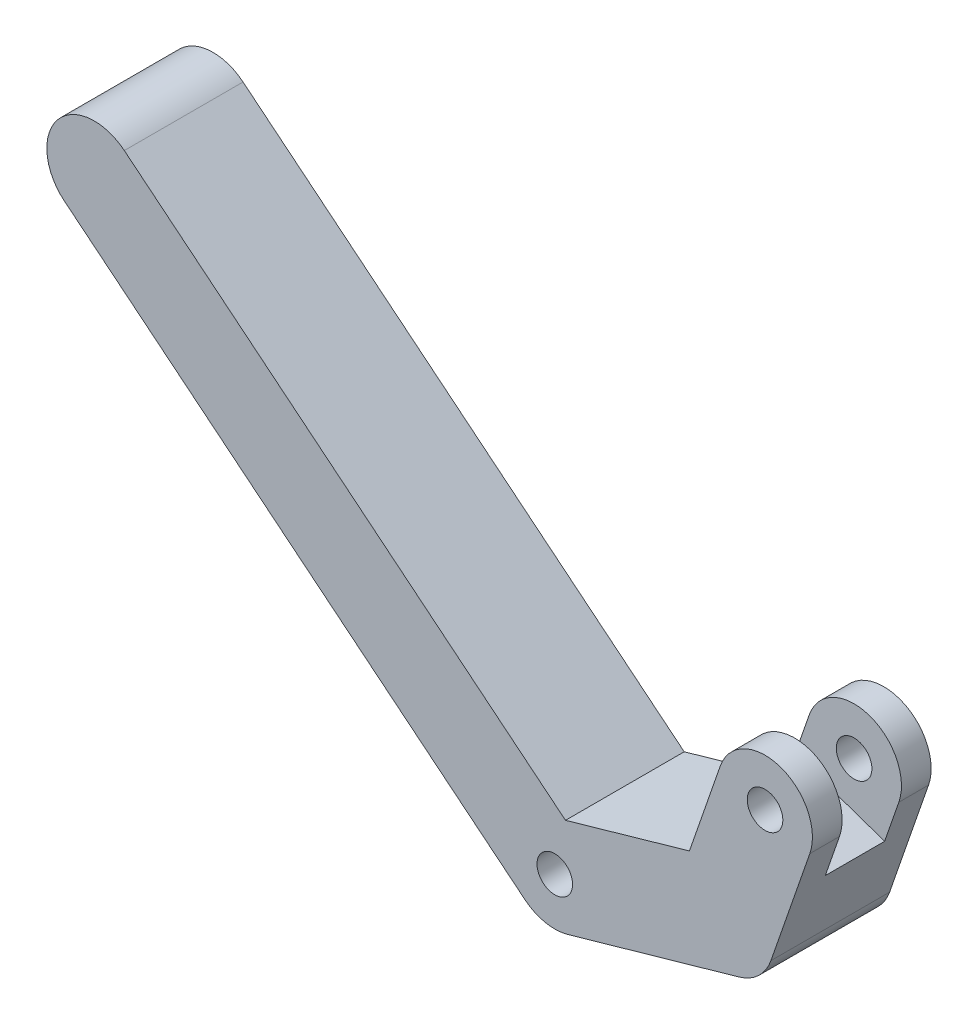
ISO-10303-21;
HEADER;
FILE_DESCRIPTION(('STEP AP214'),'2;1');
FILE_NAME('part.step','',(''),(''),'','','');
FILE_SCHEMA(('AUTOMOTIVE_DESIGN { 1 0 10303 214 1 1 1 1 }'));
ENDSEC;
DATA;
#1=APPLICATION_CONTEXT('core data for automotive mechanical design processes');
#2=APPLICATION_PROTOCOL_DEFINITION('international standard','automotive_design',2000,#1);
#3=PRODUCT_CONTEXT('',#1,'mechanical');
#4=PRODUCT('Part','Part','',(#3));
#5=PRODUCT_RELATED_PRODUCT_CATEGORY('part','',(#4));
#6=PRODUCT_DEFINITION_FORMATION('','',#4);
#7=PRODUCT_DEFINITION_CONTEXT('part definition',#1,'design');
#8=PRODUCT_DEFINITION('design','',#6,#7);
#9=PRODUCT_DEFINITION_SHAPE('','',#8);
#10=(LENGTH_UNIT() NAMED_UNIT(*) SI_UNIT(.MILLI.,.METRE.));
#11=(NAMED_UNIT(*) PLANE_ANGLE_UNIT() SI_UNIT($,.RADIAN.));
#12=(NAMED_UNIT(*) SI_UNIT($,.STERADIAN.) SOLID_ANGLE_UNIT());
#13=UNCERTAINTY_MEASURE_WITH_UNIT(LENGTH_MEASURE(1.E-05),#10,'distance_accuracy_value','');
#14=(GEOMETRIC_REPRESENTATION_CONTEXT(3) GLOBAL_UNCERTAINTY_ASSIGNED_CONTEXT((#13)) GLOBAL_UNIT_ASSIGNED_CONTEXT((#10,
#11,#12)) REPRESENTATION_CONTEXT('',''));
#15=CARTESIAN_POINT('',(0.,0.,0.));
#16=DIRECTION('',(0.,0.,1.));
#17=DIRECTION('',(1.,0.,0.));
#18=AXIS2_PLACEMENT_3D('',#15,#16,#17);
#19=CARTESIAN_POINT('',(18.1989936370334,2.79280961933587,5.));
#20=DIRECTION('',(-0.944756856127318,0.327771998194518,0.));
#21=DIRECTION('',(-0.327771998194518,-0.944756856127318,0.));
#22=AXIS2_PLACEMENT_3D('',#19,#20,#21);
#23=PLANE('',#22);
#24=DIRECTION('',(0.327771998194519,0.944756856127317,0.));
#25=VECTOR('',#24,1.);
#26=CARTESIAN_POINT('',(20.2803351049442,8.79198475504685,-2.5));
#27=LINE('',#26,#25);
#28=CARTESIAN_POINT('',(20.2803351049442,8.79198475504685,-2.5));
#29=VERTEX_POINT('',#28);
#30=CARTESIAN_POINT('',(21.4767136189786,12.240378180609,-2.5));
#31=VERTEX_POINT('',#30);
#32=EDGE_CURVE('E263',#29,#31,#27,.T.);
#33=ORIENTED_EDGE('',*,*,#32,.F.);
#34=DIRECTION('',(0.,0.,1.));
#35=VECTOR('',#34,1.);
#36=CARTESIAN_POINT('',(20.2803351049442,8.79198475504685,-2.5));
#37=LINE('',#36,#35);
#38=CARTESIAN_POINT('',(20.2803351049442,8.79198475504685,2.5));
#39=VERTEX_POINT('',#38);
#40=EDGE_CURVE('E211',#29,#39,#37,.T.);
#41=ORIENTED_EDGE('',*,*,#40,.T.);
#42=DIRECTION('',(0.327771998194519,0.944756856127317,0.));
#43=VECTOR('',#42,1.);
#44=CARTESIAN_POINT('',(20.2803351049442,8.79198475504685,2.5));
#45=LINE('',#44,#43);
#46=CARTESIAN_POINT('',(21.4767136189786,12.240378180609,2.5));
#47=VERTEX_POINT('',#46);
#48=EDGE_CURVE('E148',#39,#47,#45,.T.);
#49=ORIENTED_EDGE('',*,*,#48,.T.);
#50=DIRECTION('',(0.,0.,-1.));
#51=VECTOR('',#50,1.);
#52=CARTESIAN_POINT('',(21.4767136189786,12.240378180609,5.));
#53=LINE('',#52,#51);
#54=CARTESIAN_POINT('',(21.4767136189786,12.240378180609,5.));
#55=VERTEX_POINT('',#54);
#56=EDGE_CURVE('E144',#55,#47,#53,.T.);
#57=ORIENTED_EDGE('',*,*,#56,.F.);
#58=DIRECTION('',(0.327771998194518,0.944756856127318,0.));
#59=VECTOR('',#58,1.);
#60=CARTESIAN_POINT('',(18.1989936370334,2.79280961933587,5.));
#61=LINE('',#60,#59);
#62=CARTESIAN_POINT('',(18.1989936370334,2.79280961933587,5.));
#63=VERTEX_POINT('',#62);
#64=EDGE_CURVE('E130',#63,#55,#61,.T.);
#65=ORIENTED_EDGE('',*,*,#64,.F.);
#66=DIRECTION('',(0.,0.,-1.));
#67=VECTOR('',#66,1.);
#68=CARTESIAN_POINT('',(18.1989936370334,2.79280961933587,5.));
#69=LINE('',#68,#67);
#70=CARTESIAN_POINT('',(18.1989936370334,2.79280961933587,-5.));
#71=VERTEX_POINT('',#70);
#72=EDGE_CURVE('E151',#63,#71,#69,.T.);
#73=ORIENTED_EDGE('',*,*,#72,.T.);
#74=DIRECTION('',(0.327771998194518,0.944756856127318,0.));
#75=VECTOR('',#74,1.);
#76=CARTESIAN_POINT('',(18.1989936370334,2.79280961933587,-5.));
#77=LINE('',#76,#75);
#78=CARTESIAN_POINT('',(21.4767136189786,12.240378180609,-5.));
#79=VERTEX_POINT('',#78);
#80=EDGE_CURVE('E178',#71,#79,#77,.T.);
#81=ORIENTED_EDGE('',*,*,#80,.T.);
#82=EDGE_CURVE('E152',#31,#79,#53,.T.);
#83=ORIENTED_EDGE('',*,*,#82,.F.);
#84=EDGE_LOOP('',(#33,#41,#49,#57,#65,#73,#81,#83));
#85=FACE_BOUND('',#84,.T.);
#86=ADVANCED_FACE('F36',(#85),#23,.F.);
#87=CARTESIAN_POINT('',(17.7062470526373,13.5484960868831,5.));
#88=DIRECTION('',(0.,0.,-1.));
#89=DIRECTION('',(-1.,0.,0.));
#90=AXIS2_PLACEMENT_3D('',#87,#88,#89);
#91=CYLINDRICAL_SURFACE('',#90,3.99093855936324);
#92=CARTESIAN_POINT('',(17.7062470526373,13.5484960868831,-2.5));
#93=DIRECTION('',(0.,0.,1.));
#94=DIRECTION('',(1.,0.,0.));
#95=AXIS2_PLACEMENT_3D('',#92,#93,#94);
#96=CIRCLE('',#95,3.99093855936324);
#97=CARTESIAN_POINT('',(13.935780486296,14.8566139931571,-2.5));
#98=VERTEX_POINT('',#97);
#99=EDGE_CURVE('E220',#31,#98,#96,.T.);
#100=ORIENTED_EDGE('',*,*,#99,.F.);
#101=ORIENTED_EDGE('',*,*,#82,.T.);
#102=CARTESIAN_POINT('',(17.7062470526373,13.5484960868831,-5.));
#103=DIRECTION('',(0.,0.,1.));
#104=DIRECTION('',(1.,0.,0.));
#105=AXIS2_PLACEMENT_3D('',#102,#103,#104);
#106=CIRCLE('',#105,3.99093855936324);
#107=CARTESIAN_POINT('',(13.935780486296,14.8566139931571,-5.));
#108=VERTEX_POINT('',#107);
#109=EDGE_CURVE('E181',#79,#108,#106,.T.);
#110=ORIENTED_EDGE('',*,*,#109,.T.);
#111=DIRECTION('',(0.,0.,-1.));
#112=VECTOR('',#111,1.);
#113=CARTESIAN_POINT('',(13.935780486296,14.8566139931571,5.));
#114=LINE('',#113,#112);
#115=EDGE_CURVE('E187',#98,#108,#114,.T.);
#116=ORIENTED_EDGE('',*,*,#115,.F.);
#117=EDGE_LOOP('',(#100,#101,#110,#116));
#118=FACE_BOUND('',#117,.T.);
#119=ADVANCED_FACE('F258',(#118),#91,.T.);
#120=CARTESIAN_POINT('',(13.935780486296,14.8566139931571,5.));
#121=DIRECTION('',(0.944756856127317,-0.327771998194519,0.));
#122=DIRECTION('',(0.327771998194519,0.944756856127317,0.));
#123=AXIS2_PLACEMENT_3D('',#120,#121,#122);
#124=PLANE('',#123);
#125=DIRECTION('',(-0.327771998194519,-0.944756856127317,0.));
#126=VECTOR('',#125,1.);
#127=CARTESIAN_POINT('',(13.935780486296,14.8566139931571,-2.5));
#128=LINE('',#127,#126);
#129=CARTESIAN_POINT('',(12.7394019722616,11.4082205675949,-2.5));
#130=VERTEX_POINT('',#129);
#131=EDGE_CURVE('E281',#98,#130,#128,.T.);
#132=ORIENTED_EDGE('',*,*,#131,.F.);
#133=ORIENTED_EDGE('',*,*,#115,.T.);
#134=DIRECTION('',(-0.327771998194519,-0.944756856127317,0.));
#135=VECTOR('',#134,1.);
#136=CARTESIAN_POINT('',(13.935780486296,14.8566139931571,-5.));
#137=LINE('',#136,#135);
#138=CARTESIAN_POINT('',(11.3376461408511,7.36785580295251,-5.));
#139=VERTEX_POINT('',#138);
#140=EDGE_CURVE('E100',#108,#139,#137,.T.);
#141=ORIENTED_EDGE('',*,*,#140,.T.);
#142=DIRECTION('',(0.,0.,-1.));
#143=VECTOR('',#142,1.);
#144=CARTESIAN_POINT('',(11.3376461408511,7.36785580295251,5.));
#145=LINE('',#144,#143);
#146=CARTESIAN_POINT('',(11.3376461408511,7.36785580295251,5.));
#147=VERTEX_POINT('',#146);
#148=EDGE_CURVE('E158',#147,#139,#145,.T.);
#149=ORIENTED_EDGE('',*,*,#148,.F.);
#150=DIRECTION('',(-0.327771998194519,-0.944756856127317,0.));
#151=VECTOR('',#150,1.);
#152=CARTESIAN_POINT('',(13.935780486296,14.8566139931571,5.));
#153=LINE('',#152,#151);
#154=CARTESIAN_POINT('',(13.935780486296,14.8566139931571,5.));
#155=VERTEX_POINT('',#154);
#156=EDGE_CURVE('E62',#155,#147,#153,.T.);
#157=ORIENTED_EDGE('',*,*,#156,.F.);
#158=CARTESIAN_POINT('',(13.935780486296,14.8566139931571,2.5));
#159=VERTEX_POINT('',#158);
#160=EDGE_CURVE('E156',#155,#159,#114,.T.);
#161=ORIENTED_EDGE('',*,*,#160,.T.);
#162=DIRECTION('',(-0.327771998194519,-0.944756856127317,0.));
#163=VECTOR('',#162,1.);
#164=CARTESIAN_POINT('',(13.935780486296,14.8566139931571,2.5));
#165=LINE('',#164,#163);
#166=CARTESIAN_POINT('',(12.7394019722616,11.4082205675949,2.5));
#167=VERTEX_POINT('',#166);
#168=EDGE_CURVE('E274',#159,#167,#165,.T.);
#169=ORIENTED_EDGE('',*,*,#168,.T.);
#170=DIRECTION('',(0.,0.,1.));
#171=VECTOR('',#170,1.);
#172=CARTESIAN_POINT('',(12.7394019722616,11.4082205675949,-2.5));
#173=LINE('',#172,#171);
#174=EDGE_CURVE('E216',#130,#167,#173,.T.);
#175=ORIENTED_EDGE('',*,*,#174,.F.);
#176=EDGE_LOOP('',(#132,#133,#141,#149,#157,#161,#169,#175));
#177=FACE_BOUND('',#176,.T.);
#178=ADVANCED_FACE('F287',(#177),#124,.F.);
#179=CARTESIAN_POINT('',(17.7062470526373,13.5484960868831,-10.));
#180=DIRECTION('',(0.,0.,1.));
#181=DIRECTION('',(1.,0.,0.));
#182=AXIS2_PLACEMENT_3D('',#179,#180,#181);
#183=CYLINDRICAL_SURFACE('',#182,1.5);
#184=CARTESIAN_POINT('',(17.7062470526373,13.5484960868831,-5.));
#185=DIRECTION('',(0.,0.,1.));
#186=DIRECTION('',(1.,0.,0.));
#187=AXIS2_PLACEMENT_3D('',#184,#185,#186);
#188=CIRCLE('',#187,1.5);
#189=CARTESIAN_POINT('',(19.2062470526373,13.5484960868831,-5.));
#190=VERTEX_POINT('',#189);
#191=EDGE_CURVE('E166',#190,#190,#188,.T.);
#192=ORIENTED_EDGE('',*,*,#191,.F.);
#193=EDGE_LOOP('',(#192));
#194=FACE_BOUND('',#193,.T.);
#195=CARTESIAN_POINT('',(17.7062470526373,13.5484960868831,-2.5));
#196=DIRECTION('',(0.,0.,1.));
#197=DIRECTION('',(1.,0.,0.));
#198=AXIS2_PLACEMENT_3D('',#195,#196,#197);
#199=CIRCLE('',#198,1.5);
#200=CARTESIAN_POINT('',(19.2062470526373,13.5484960868831,-2.5));
#201=VERTEX_POINT('',#200);
#202=EDGE_CURVE('E40',#201,#201,#199,.F.);
#203=ORIENTED_EDGE('',*,*,#202,.F.);
#204=EDGE_LOOP('',(#203));
#205=FACE_BOUND('',#204,.T.);
#206=ADVANCED_FACE('F345',(#194,#205),#183,.F.);
#207=CARTESIAN_POINT('',(11.3376461408511,7.36785580295251,5.));
#208=DIRECTION('',(0.274989322424209,-0.96144728017332,0.));
#209=DIRECTION('',(0.96144728017332,0.274989322424209,0.));
#210=AXIS2_PLACEMENT_3D('',#207,#208,#209);
#211=PLANE('',#210);
#212=DIRECTION('',(-0.96144728017332,-0.274989322424209,0.));
#213=VECTOR('',#212,1.);
#214=CARTESIAN_POINT('',(11.3376461408511,7.36785580295251,-5.));
#215=LINE('',#214,#213);
#216=CARTESIAN_POINT('',(0.900459327258787,4.38265319322934,-5.));
#217=VERTEX_POINT('',#216);
#218=EDGE_CURVE('E162',#139,#217,#215,.T.);
#219=ORIENTED_EDGE('',*,*,#218,.T.);
#220=DIRECTION('',(0.,0.,-1.));
#221=VECTOR('',#220,1.);
#222=CARTESIAN_POINT('',(0.900459327258787,4.38265319322934,5.));
#223=LINE('',#222,#221);
#224=CARTESIAN_POINT('',(0.900459327258787,4.38265319322934,5.));
#225=VERTEX_POINT('',#224);
#226=EDGE_CURVE('E11',#225,#217,#223,.T.);
#227=ORIENTED_EDGE('',*,*,#226,.F.);
#228=DIRECTION('',(-0.96144728017332,-0.274989322424209,0.));
#229=VECTOR('',#228,1.);
#230=CARTESIAN_POINT('',(11.3376461408511,7.36785580295251,5.));
#231=LINE('',#230,#229);
#232=EDGE_CURVE('E185',#147,#225,#231,.T.);
#233=ORIENTED_EDGE('',*,*,#232,.F.);
#234=ORIENTED_EDGE('',*,*,#148,.T.);
#235=EDGE_LOOP('',(#219,#227,#233,#234));
#236=FACE_BOUND('',#235,.T.);
#237=ADVANCED_FACE('F38',(#236),#211,.F.);
#238=CARTESIAN_POINT('',(-36.2572158179067,34.6575506747938,5.));
#239=DIRECTION('',(-0.631651299762139,-0.775252626895775,0.));
#240=DIRECTION('',(0.775252626895775,-0.631651299762139,0.));
#241=AXIS2_PLACEMENT_3D('',#238,#239,#240);
#242=PLANE('',#241);
#243=DIRECTION('',(-0.775252626895775,0.631651299762139,0.));
#244=VECTOR('',#243,1.);
#245=CARTESIAN_POINT('',(-36.2572158179067,34.6575506747938,-5.));
#246=LINE('',#245,#244);
#247=CARTESIAN_POINT('',(-36.2572158179067,34.6575506747938,-5.));
#248=VERTEX_POINT('',#247);
#249=EDGE_CURVE('E165',#217,#248,#246,.T.);
#250=ORIENTED_EDGE('',*,*,#249,.T.);
#251=DIRECTION('',(0.,0.,-1.));
#252=VECTOR('',#251,1.);
#253=CARTESIAN_POINT('',(-36.2572158179067,34.6575506747938,5.));
#254=LINE('',#253,#252);
#255=CARTESIAN_POINT('',(-36.2572158179067,34.6575506747938,5.));
#256=VERTEX_POINT('',#255);
#257=EDGE_CURVE('E45',#256,#248,#254,.T.);
#258=ORIENTED_EDGE('',*,*,#257,.F.);
#259=DIRECTION('',(-0.775252626895775,0.631651299762139,0.));
#260=VECTOR('',#259,1.);
#261=CARTESIAN_POINT('',(-36.2572158179067,34.6575506747938,5.));
#262=LINE('',#261,#260);
#263=EDGE_CURVE('E108',#225,#256,#262,.T.);
#264=ORIENTED_EDGE('',*,*,#263,.F.);
#265=ORIENTED_EDGE('',*,*,#226,.T.);
#266=EDGE_LOOP('',(#250,#258,#264,#265));
#267=FACE_BOUND('',#266,.T.);
#268=ADVANCED_FACE('F297',(#267),#242,.F.);
#269=CARTESIAN_POINT('',(-38.7838210169553,31.5565401672106,5.));
#270=DIRECTION('',(0.,0.,-1.));
#271=DIRECTION('',(-1.,0.,0.));
#272=AXIS2_PLACEMENT_3D('',#269,#270,#271);
#273=CYLINDRICAL_SURFACE('',#272,4.00000000000001);
#274=CARTESIAN_POINT('',(-38.7838210169553,31.5565401672106,-5.));
#275=DIRECTION('',(0.,0.,1.));
#276=DIRECTION('',(1.,0.,0.));
#277=AXIS2_PLACEMENT_3D('',#274,#275,#276);
#278=CIRCLE('',#277,4.00000000000001);
#279=CARTESIAN_POINT('',(-41.3083442303321,28.4538344858542,-5.));
#280=VERTEX_POINT('',#279);
#281=EDGE_CURVE('E168',#248,#280,#278,.T.);
#282=ORIENTED_EDGE('',*,*,#281,.T.);
#283=DIRECTION('',(0.,0.,-1.));
#284=VECTOR('',#283,1.);
#285=CARTESIAN_POINT('',(-41.3083442303321,28.4538344858542,5.));
#286=LINE('',#285,#284);
#287=CARTESIAN_POINT('',(-41.3083442303321,28.4538344858542,5.));
#288=VERTEX_POINT('',#287);
#289=EDGE_CURVE('E199',#288,#280,#286,.T.);
#290=ORIENTED_EDGE('',*,*,#289,.F.);
#291=CARTESIAN_POINT('',(-38.7838210169553,31.5565401672106,5.));
#292=DIRECTION('',(0.,0.,1.));
#293=DIRECTION('',(1.,0.,0.));
#294=AXIS2_PLACEMENT_3D('',#291,#292,#293);
#295=CIRCLE('',#294,4.00000000000001);
#296=EDGE_CURVE('E232',#256,#288,#295,.T.);
#297=ORIENTED_EDGE('',*,*,#296,.F.);
#298=ORIENTED_EDGE('',*,*,#257,.T.);
#299=EDGE_LOOP('',(#282,#290,#297,#298));
#300=FACE_BOUND('',#299,.T.);
#301=ADVANCED_FACE('F300',(#300),#273,.T.);
#302=CARTESIAN_POINT('',(-41.3083442303321,28.4538344858542,5.));
#303=DIRECTION('',(0.631130803344213,0.775676420339105,0.));
#304=DIRECTION('',(-0.775676420339105,0.631130803344213,0.));
#305=AXIS2_PLACEMENT_3D('',#302,#303,#304);
#306=PLANE('',#305);
#307=DIRECTION('',(0.775676420339105,-0.631130803344213,0.));
#308=VECTOR('',#307,1.);
#309=CARTESIAN_POINT('',(-41.3083442303321,28.4538344858542,-5.));
#310=LINE('',#309,#308);
#311=CARTESIAN_POINT('',(-2.52452321337685,-3.10270568135642,-5.));
#312=VERTEX_POINT('',#311);
#313=EDGE_CURVE('E170',#280,#312,#310,.T.);
#314=ORIENTED_EDGE('',*,*,#313,.T.);
#315=DIRECTION('',(0.,0.,-1.));
#316=VECTOR('',#315,1.);
#317=CARTESIAN_POINT('',(-2.52452321337685,-3.10270568135642,5.));
#318=LINE('',#317,#316);
#319=CARTESIAN_POINT('',(-2.52452321337685,-3.10270568135642,5.));
#320=VERTEX_POINT('',#319);
#321=EDGE_CURVE('E196',#320,#312,#318,.T.);
#322=ORIENTED_EDGE('',*,*,#321,.F.);
#323=DIRECTION('',(0.775676420339105,-0.631130803344213,0.));
#324=VECTOR('',#323,1.);
#325=CARTESIAN_POINT('',(-41.3083442303321,28.4538344858542,5.));
#326=LINE('',#325,#324);
#327=EDGE_CURVE('E234',#288,#320,#326,.T.);
#328=ORIENTED_EDGE('',*,*,#327,.F.);
#329=ORIENTED_EDGE('',*,*,#289,.T.);
#330=EDGE_LOOP('',(#314,#322,#328,#329));
#331=FACE_BOUND('',#330,.T.);
#332=ADVANCED_FACE('F305',(#331),#306,.F.);
#333=CARTESIAN_POINT('',(0.,0.,5.));
#334=DIRECTION('',(0.,0.,-1.));
#335=DIRECTION('',(-1.,0.,0.));
#336=AXIS2_PLACEMENT_3D('',#333,#334,#335);
#337=CYLINDRICAL_SURFACE('',#336,4.);
#338=CARTESIAN_POINT('',(0.,0.,-5.));
#339=DIRECTION('',(0.,0.,1.));
#340=DIRECTION('',(1.,0.,0.));
#341=AXIS2_PLACEMENT_3D('',#338,#339,#340);
#342=CIRCLE('',#341,4.);
#343=CARTESIAN_POINT('',(1.09590479824847,-3.84694588903665,-5.));
#344=VERTEX_POINT('',#343);
#345=EDGE_CURVE('E172',#312,#344,#342,.T.);
#346=ORIENTED_EDGE('',*,*,#345,.T.);
#347=DIRECTION('',(0.,0.,-1.));
#348=VECTOR('',#347,1.);
#349=CARTESIAN_POINT('',(1.09590479824847,-3.84694588903665,5.));
#350=LINE('',#349,#348);
#351=CARTESIAN_POINT('',(1.09590479824847,-3.84694588903665,5.));
#352=VERTEX_POINT('',#351);
#353=EDGE_CURVE('E193',#352,#344,#350,.T.);
#354=ORIENTED_EDGE('',*,*,#353,.F.);
#355=CARTESIAN_POINT('',(0.,0.,5.));
#356=DIRECTION('',(0.,0.,1.));
#357=DIRECTION('',(1.,0.,0.));
#358=AXIS2_PLACEMENT_3D('',#355,#356,#357);
#359=CIRCLE('',#358,4.);
#360=EDGE_CURVE('E236',#320,#352,#359,.T.);
#361=ORIENTED_EDGE('',*,*,#360,.F.);
#362=ORIENTED_EDGE('',*,*,#321,.T.);
#363=EDGE_LOOP('',(#346,#354,#361,#362));
#364=FACE_BOUND('',#363,.T.);
#365=ADVANCED_FACE('F308',(#364),#337,.T.);
#366=CARTESIAN_POINT('',(1.09590479824847,-3.84694588903665,5.));
#367=DIRECTION('',(-0.273976199562116,0.961736472259163,0.));
#368=DIRECTION('',(-0.961736472259163,-0.273976199562116,0.));
#369=AXIS2_PLACEMENT_3D('',#366,#367,#368);
#370=PLANE('',#369);
#371=DIRECTION('',(0.961736472259163,0.273976199562116,0.));
#372=VECTOR('',#371,1.);
#373=CARTESIAN_POINT('',(1.09590479824847,-3.84694588903665,-5.));
#374=LINE('',#373,#372);
#375=CARTESIAN_POINT('',(15.5219492498723,0.262696354524846,-5.));
#376=VERTEX_POINT('',#375);
#377=EDGE_CURVE('E174',#344,#376,#374,.T.);
#378=ORIENTED_EDGE('',*,*,#377,.T.);
#379=DIRECTION('',(0.,0.,-1.));
#380=VECTOR('',#379,1.);
#381=CARTESIAN_POINT('',(15.5219492498723,0.262696354524846,5.));
#382=LINE('',#381,#380);
#383=CARTESIAN_POINT('',(15.5219492498723,0.262696354524846,5.));
#384=VERTEX_POINT('',#383);
#385=EDGE_CURVE('E190',#384,#376,#382,.T.);
#386=ORIENTED_EDGE('',*,*,#385,.F.);
#387=DIRECTION('',(0.961736472259163,0.273976199562116,0.));
#388=VECTOR('',#387,1.);
#389=CARTESIAN_POINT('',(1.09590479824847,-3.84694588903665,5.));
#390=LINE('',#389,#388);
#391=EDGE_CURVE('E238',#352,#384,#390,.T.);
#392=ORIENTED_EDGE('',*,*,#391,.F.);
#393=ORIENTED_EDGE('',*,*,#353,.T.);
#394=EDGE_LOOP('',(#378,#386,#392,#393));
#395=FACE_BOUND('',#394,.T.);
#396=ADVANCED_FACE('F244',(#395),#370,.F.);
#397=CARTESIAN_POINT('',(14.4285270706921,4.10092752560991,5.));
#398=DIRECTION('',(0.,0.,-1.));
#399=DIRECTION('',(-1.,0.,0.));
#400=AXIS2_PLACEMENT_3D('',#397,#398,#399);
#401=CYLINDRICAL_SURFACE('',#400,3.99093855936324);
#402=CARTESIAN_POINT('',(14.4285270706921,4.10092752560991,-5.));
#403=DIRECTION('',(0.,0.,1.));
#404=DIRECTION('',(1.,0.,0.));
#405=AXIS2_PLACEMENT_3D('',#402,#403,#404);
#406=CIRCLE('',#405,3.99093855936324);
#407=EDGE_CURVE('E176',#376,#71,#406,.T.);
#408=ORIENTED_EDGE('',*,*,#407,.T.);
#409=ORIENTED_EDGE('',*,*,#72,.F.);
#410=CARTESIAN_POINT('',(14.4285270706921,4.10092752560991,5.));
#411=DIRECTION('',(0.,0.,1.));
#412=DIRECTION('',(1.,0.,0.));
#413=AXIS2_PLACEMENT_3D('',#410,#411,#412);
#414=CIRCLE('',#413,3.99093855936324);
#415=EDGE_CURVE('E137',#384,#63,#414,.T.);
#416=ORIENTED_EDGE('',*,*,#415,.F.);
#417=ORIENTED_EDGE('',*,*,#385,.T.);
#418=EDGE_LOOP('',(#408,#409,#416,#417));
#419=FACE_BOUND('',#418,.T.);
#420=ADVANCED_FACE('F248',(#419),#401,.T.);
#421=ORIENTED_EDGE('',*,*,#56,.T.);
#422=CARTESIAN_POINT('',(17.7062470526373,13.5484960868831,2.5));
#423=DIRECTION('',(0.,0.,1.));
#424=DIRECTION('',(1.,0.,0.));
#425=AXIS2_PLACEMENT_3D('',#422,#423,#424);
#426=CIRCLE('',#425,3.99093855936324);
#427=EDGE_CURVE('E223',#47,#159,#426,.T.);
#428=ORIENTED_EDGE('',*,*,#427,.T.);
#429=ORIENTED_EDGE('',*,*,#160,.F.);
#430=CARTESIAN_POINT('',(17.7062470526373,13.5484960868831,5.));
#431=DIRECTION('',(0.,0.,1.));
#432=DIRECTION('',(1.,0.,0.));
#433=AXIS2_PLACEMENT_3D('',#430,#431,#432);
#434=CIRCLE('',#433,3.99093855936324);
#435=EDGE_CURVE('E134',#55,#155,#434,.T.);
#436=ORIENTED_EDGE('',*,*,#435,.F.);
#437=EDGE_LOOP('',(#421,#428,#429,#436));
#438=FACE_BOUND('',#437,.T.);
#439=ADVANCED_FACE('F154',(#438),#91,.T.);
#440=CARTESIAN_POINT('',(-38.7838210169553,31.5565401672106,5.));
#441=DIRECTION('',(0.,0.,1.));
#442=DIRECTION('',(1.,0.,0.));
#443=AXIS2_PLACEMENT_3D('',#440,#441,#442);
#444=PLANE('',#443);
#445=CARTESIAN_POINT('',(17.7062470526373,13.5484960868831,5.));
#446=DIRECTION('',(0.,0.,1.));
#447=DIRECTION('',(1.,0.,0.));
#448=AXIS2_PLACEMENT_3D('',#445,#446,#447);
#449=CIRCLE('',#448,1.5);
#450=CARTESIAN_POINT('',(19.2062470526373,13.5484960868831,5.));
#451=VERTEX_POINT('',#450);
#452=EDGE_CURVE('E207',#451,#451,#449,.T.);
#453=ORIENTED_EDGE('',*,*,#452,.F.);
#454=EDGE_LOOP('',(#453));
#455=FACE_BOUND('',#454,.T.);
#456=CARTESIAN_POINT('',(0.,0.,5.));
#457=DIRECTION('',(0.,0.,1.));
#458=DIRECTION('',(1.,0.,0.));
#459=AXIS2_PLACEMENT_3D('',#456,#457,#458);
#460=CIRCLE('',#459,1.5);
#461=CARTESIAN_POINT('',(1.5,0.,5.));
#462=VERTEX_POINT('',#461);
#463=EDGE_CURVE('E215',#462,#462,#460,.T.);
#464=ORIENTED_EDGE('',*,*,#463,.F.);
#465=EDGE_LOOP('',(#464));
#466=FACE_BOUND('',#465,.T.);
#467=ORIENTED_EDGE('',*,*,#232,.T.);
#468=ORIENTED_EDGE('',*,*,#263,.T.);
#469=ORIENTED_EDGE('',*,*,#296,.T.);
#470=ORIENTED_EDGE('',*,*,#327,.T.);
#471=ORIENTED_EDGE('',*,*,#360,.T.);
#472=ORIENTED_EDGE('',*,*,#391,.T.);
#473=ORIENTED_EDGE('',*,*,#415,.T.);
#474=ORIENTED_EDGE('',*,*,#64,.T.);
#475=ORIENTED_EDGE('',*,*,#435,.T.);
#476=ORIENTED_EDGE('',*,*,#156,.T.);
#477=EDGE_LOOP('',(#467,#468,#469,#470,#471,#472,#473,#474,#475,#476));
#478=FACE_BOUND('',#477,.T.);
#479=ADVANCED_FACE('F132',(#455,#466,#478),#444,.T.);
#480=CARTESIAN_POINT('',(-38.7838210169553,31.5565401672106,-5.));
#481=DIRECTION('',(0.,0.,1.));
#482=DIRECTION('',(1.,0.,0.));
#483=AXIS2_PLACEMENT_3D('',#480,#481,#482);
#484=PLANE('',#483);
#485=ORIENTED_EDGE('',*,*,#191,.T.);
#486=EDGE_LOOP('',(#485));
#487=FACE_BOUND('',#486,.T.);
#488=CARTESIAN_POINT('',(0.,0.,-5.));
#489=DIRECTION('',(0.,0.,1.));
#490=DIRECTION('',(1.,0.,0.));
#491=AXIS2_PLACEMENT_3D('',#488,#489,#490);
#492=CIRCLE('',#491,1.5);
#493=CARTESIAN_POINT('',(1.5,0.,-5.));
#494=VERTEX_POINT('',#493);
#495=EDGE_CURVE('E204',#494,#494,#492,.T.);
#496=ORIENTED_EDGE('',*,*,#495,.T.);
#497=EDGE_LOOP('',(#496));
#498=FACE_BOUND('',#497,.T.);
#499=ORIENTED_EDGE('',*,*,#218,.F.);
#500=ORIENTED_EDGE('',*,*,#140,.F.);
#501=ORIENTED_EDGE('',*,*,#109,.F.);
#502=ORIENTED_EDGE('',*,*,#80,.F.);
#503=ORIENTED_EDGE('',*,*,#407,.F.);
#504=ORIENTED_EDGE('',*,*,#377,.F.);
#505=ORIENTED_EDGE('',*,*,#345,.F.);
#506=ORIENTED_EDGE('',*,*,#313,.F.);
#507=ORIENTED_EDGE('',*,*,#281,.F.);
#508=ORIENTED_EDGE('',*,*,#249,.F.);
#509=EDGE_LOOP('',(#499,#500,#501,#502,#503,#504,#505,#506,#507,#508));
#510=FACE_BOUND('',#509,.T.);
#511=ADVANCED_FACE('F254',(#487,#498,#510),#484,.F.);
#512=CARTESIAN_POINT('',(0.,0.,-10.));
#513=DIRECTION('',(0.,0.,1.));
#514=DIRECTION('',(1.,0.,0.));
#515=AXIS2_PLACEMENT_3D('',#512,#513,#514);
#516=CYLINDRICAL_SURFACE('',#515,1.5);
#517=ORIENTED_EDGE('',*,*,#463,.T.);
#518=EDGE_LOOP('',(#517));
#519=FACE_BOUND('',#518,.T.);
#520=ORIENTED_EDGE('',*,*,#495,.F.);
#521=EDGE_LOOP('',(#520));
#522=FACE_BOUND('',#521,.T.);
#523=ADVANCED_FACE('F337',(#519,#522),#516,.F.);
#524=CARTESIAN_POINT('',(17.7062470526373,13.5484960868831,2.5));
#525=DIRECTION('',(0.,0.,1.));
#526=DIRECTION('',(1.,0.,0.));
#527=AXIS2_PLACEMENT_3D('',#524,#525,#526);
#528=CIRCLE('',#527,1.5);
#529=CARTESIAN_POINT('',(19.2062470526373,13.5484960868831,2.5));
#530=VERTEX_POINT('',#529);
#531=EDGE_CURVE('E209',#530,#530,#528,.F.);
#532=ORIENTED_EDGE('',*,*,#531,.T.);
#533=EDGE_LOOP('',(#532));
#534=FACE_BOUND('',#533,.T.);
#535=ORIENTED_EDGE('',*,*,#452,.T.);
#536=EDGE_LOOP('',(#535));
#537=FACE_BOUND('',#536,.T.);
#538=ADVANCED_FACE('F350',(#534,#537),#183,.F.);
#539=CARTESIAN_POINT('',(17.7062470526373,13.5484960868831,-2.5));
#540=DIRECTION('',(0.,0.,1.));
#541=DIRECTION('',(1.,0.,0.));
#542=AXIS2_PLACEMENT_3D('',#539,#540,#541);
#543=PLANE('',#542);
#544=ORIENTED_EDGE('',*,*,#131,.T.);
#545=DIRECTION('',(0.944756856127318,-0.327771998194518,0.));
#546=VECTOR('',#545,1.);
#547=CARTESIAN_POINT('',(12.7394019722616,11.4082205675949,-2.5));
#548=LINE('',#547,#546);
#549=EDGE_CURVE('E277',#130,#29,#548,.T.);
#550=ORIENTED_EDGE('',*,*,#549,.T.);
#551=ORIENTED_EDGE('',*,*,#32,.T.);
#552=ORIENTED_EDGE('',*,*,#99,.T.);
#553=EDGE_LOOP('',(#544,#550,#551,#552));
#554=FACE_BOUND('',#553,.T.);
#555=ORIENTED_EDGE('',*,*,#202,.T.);
#556=EDGE_LOOP('',(#555));
#557=FACE_BOUND('',#556,.T.);
#558=ADVANCED_FACE('F284',(#554,#557),#543,.T.);
#559=CARTESIAN_POINT('',(17.7062470526373,13.5484960868831,2.5));
#560=DIRECTION('',(0.,0.,1.));
#561=DIRECTION('',(1.,0.,0.));
#562=AXIS2_PLACEMENT_3D('',#559,#560,#561);
#563=PLANE('',#562);
#564=ORIENTED_EDGE('',*,*,#168,.F.);
#565=ORIENTED_EDGE('',*,*,#427,.F.);
#566=ORIENTED_EDGE('',*,*,#48,.F.);
#567=DIRECTION('',(0.944756856127318,-0.327771998194518,0.));
#568=VECTOR('',#567,1.);
#569=CARTESIAN_POINT('',(12.7394019722616,11.4082205675949,2.5));
#570=LINE('',#569,#568);
#571=EDGE_CURVE('E53',#167,#39,#570,.T.);
#572=ORIENTED_EDGE('',*,*,#571,.F.);
#573=EDGE_LOOP('',(#564,#565,#566,#572));
#574=FACE_BOUND('',#573,.T.);
#575=ORIENTED_EDGE('',*,*,#531,.F.);
#576=EDGE_LOOP('',(#575));
#577=FACE_BOUND('',#576,.T.);
#578=ADVANCED_FACE('F362',(#574,#577),#563,.F.);
#579=CARTESIAN_POINT('',(12.7394019722616,11.4082205675949,-2.5));
#580=DIRECTION('',(-0.327771998194518,-0.944756856127317,0.));
#581=DIRECTION('',(0.944756856127317,-0.327771998194518,0.));
#582=AXIS2_PLACEMENT_3D('',#579,#580,#581);
#583=PLANE('',#582);
#584=ORIENTED_EDGE('',*,*,#571,.T.);
#585=ORIENTED_EDGE('',*,*,#40,.F.);
#586=ORIENTED_EDGE('',*,*,#549,.F.);
#587=ORIENTED_EDGE('',*,*,#174,.T.);
#588=EDGE_LOOP('',(#584,#585,#586,#587));
#589=FACE_BOUND('',#588,.T.);
#590=ADVANCED_FACE('F279',(#589),#583,.F.);
#591=CLOSED_SHELL('',(#86,#119,#178,#206,#237,#268,#301,#332,#365,#396,#420,#439,#479,#511,#523,
#538,#558,#578,#590));
#592=MANIFOLD_SOLID_BREP('B2',#591);
#593=ADVANCED_BREP_SHAPE_REPRESENTATION('',(#18,#592),#14);
#594=SHAPE_DEFINITION_REPRESENTATION(#9,#593);
ENDSEC;
END-ISO-10303-21;
